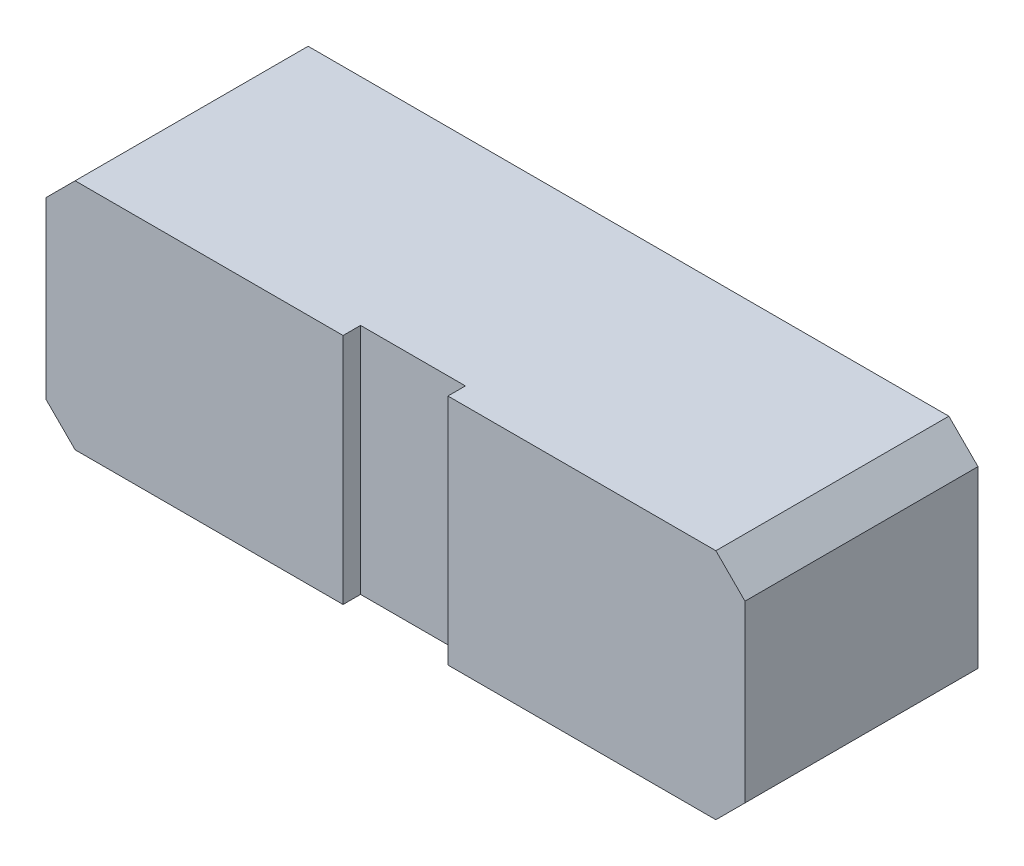
ISO-10303-21;
HEADER;
FILE_DESCRIPTION(('STEP AP214'),'2;1');
FILE_NAME('part.step','',(''),(''),'','','');
FILE_SCHEMA(('AUTOMOTIVE_DESIGN { 1 0 10303 214 1 1 1 1 }'));
ENDSEC;
DATA;
#1=APPLICATION_CONTEXT('core data for automotive mechanical design processes');
#2=APPLICATION_PROTOCOL_DEFINITION('international standard','automotive_design',2000,#1);
#3=PRODUCT_CONTEXT('',#1,'mechanical');
#4=PRODUCT('Part','Part','',(#3));
#5=PRODUCT_RELATED_PRODUCT_CATEGORY('part','',(#4));
#6=PRODUCT_DEFINITION_FORMATION('','',#4);
#7=PRODUCT_DEFINITION_CONTEXT('part definition',#1,'design');
#8=PRODUCT_DEFINITION('design','',#6,#7);
#9=PRODUCT_DEFINITION_SHAPE('','',#8);
#10=(LENGTH_UNIT() NAMED_UNIT(*) SI_UNIT(.MILLI.,.METRE.));
#11=(NAMED_UNIT(*) PLANE_ANGLE_UNIT() SI_UNIT($,.RADIAN.));
#12=(NAMED_UNIT(*) SI_UNIT($,.STERADIAN.) SOLID_ANGLE_UNIT());
#13=UNCERTAINTY_MEASURE_WITH_UNIT(LENGTH_MEASURE(1.E-05),#10,'distance_accuracy_value','');
#14=(GEOMETRIC_REPRESENTATION_CONTEXT(3) GLOBAL_UNCERTAINTY_ASSIGNED_CONTEXT((#13)) GLOBAL_UNIT_ASSIGNED_CONTEXT((#10,
#11,#12)) REPRESENTATION_CONTEXT('',''));
#15=CARTESIAN_POINT('',(0.,0.,0.));
#16=DIRECTION('',(0.,0.,1.));
#17=DIRECTION('',(1.,0.,0.));
#18=AXIS2_PLACEMENT_3D('',#15,#16,#17);
#19=CARTESIAN_POINT('',(0.,0.,20.));
#20=DIRECTION('',(0.,0.,1.));
#21=DIRECTION('',(1.,0.,0.));
#22=AXIS2_PLACEMENT_3D('',#19,#20,#21);
#23=PLANE('',#22);
#24=DIRECTION('',(0.,1.,0.));
#25=VECTOR('',#24,1.);
#26=CARTESIAN_POINT('',(60.,20.,20.));
#27=LINE('',#26,#25);
#28=CARTESIAN_POINT('',(60.,-15.,20.));
#29=VERTEX_POINT('',#28);
#30=CARTESIAN_POINT('',(60.,15.,20.));
#31=VERTEX_POINT('',#30);
#32=EDGE_CURVE('E164',#29,#31,#27,.T.);
#33=ORIENTED_EDGE('',*,*,#32,.T.);
#34=DIRECTION('',(0.707106781186547,-0.707106781186549,0.));
#35=VECTOR('',#34,1.);
#36=CARTESIAN_POINT('',(37.5000000000001,37.5,20.));
#37=LINE('',#36,#35);
#38=CARTESIAN_POINT('',(55.,20.,20.));
#39=VERTEX_POINT('',#38);
#40=EDGE_CURVE('E205',#31,#39,#37,.F.);
#41=ORIENTED_EDGE('',*,*,#40,.T.);
#42=DIRECTION('',(-1.,0.,0.));
#43=VECTOR('',#42,1.);
#44=CARTESIAN_POINT('',(-60.,20.,20.));
#45=LINE('',#44,#43);
#46=CARTESIAN_POINT('',(9.,20.,20.));
#47=VERTEX_POINT('',#46);
#48=EDGE_CURVE('E169',#39,#47,#45,.T.);
#49=ORIENTED_EDGE('',*,*,#48,.T.);
#50=DIRECTION('',(0.,1.,0.));
#51=VECTOR('',#50,1.);
#52=CARTESIAN_POINT('',(9.,20.,20.));
#53=LINE('',#52,#51);
#54=CARTESIAN_POINT('',(9.,-20.,20.));
#55=VERTEX_POINT('',#54);
#56=EDGE_CURVE('E130',#55,#47,#53,.T.);
#57=ORIENTED_EDGE('',*,*,#56,.F.);
#58=DIRECTION('',(1.,0.,0.));
#59=VECTOR('',#58,1.);
#60=CARTESIAN_POINT('',(-60.,-20.,20.));
#61=LINE('',#60,#59);
#62=CARTESIAN_POINT('',(55.,-20.,20.));
#63=VERTEX_POINT('',#62);
#64=EDGE_CURVE('E173',#55,#63,#61,.T.);
#65=ORIENTED_EDGE('',*,*,#64,.T.);
#66=DIRECTION('',(-0.707106781186549,-0.707106781186547,0.));
#67=VECTOR('',#66,1.);
#68=CARTESIAN_POINT('',(37.4999999999999,-37.5,20.));
#69=LINE('',#68,#67);
#70=EDGE_CURVE('E203',#63,#29,#69,.F.);
#71=ORIENTED_EDGE('',*,*,#70,.T.);
#72=EDGE_LOOP('',(#33,#41,#49,#57,#65,#71));
#73=FACE_BOUND('',#72,.T.);
#74=ADVANCED_FACE('F35',(#73),#23,.T.);
#75=CARTESIAN_POINT('',(60.,20.,20.));
#76=DIRECTION('',(-1.,0.,0.));
#77=DIRECTION('',(0.,-1.,0.));
#78=AXIS2_PLACEMENT_3D('',#75,#76,#77);
#79=PLANE('',#78);
#80=DIRECTION('',(0.,1.,0.));
#81=VECTOR('',#80,1.);
#82=CARTESIAN_POINT('',(60.,20.,-20.));
#83=LINE('',#82,#81);
#84=CARTESIAN_POINT('',(60.,-15.,-20.));
#85=VERTEX_POINT('',#84);
#86=CARTESIAN_POINT('',(60.,15.,-20.));
#87=VERTEX_POINT('',#86);
#88=EDGE_CURVE('E159',#85,#87,#83,.T.);
#89=ORIENTED_EDGE('',*,*,#88,.T.);
#90=DIRECTION('',(0.,0.,1.));
#91=VECTOR('',#90,1.);
#92=CARTESIAN_POINT('',(60.,15.,20.));
#93=LINE('',#92,#91);
#94=EDGE_CURVE('E201',#87,#31,#93,.T.);
#95=ORIENTED_EDGE('',*,*,#94,.T.);
#96=ORIENTED_EDGE('',*,*,#32,.F.);
#97=DIRECTION('',(0.,0.,-1.));
#98=VECTOR('',#97,1.);
#99=CARTESIAN_POINT('',(60.,-15.,20.));
#100=LINE('',#99,#98);
#101=EDGE_CURVE('E198',#29,#85,#100,.T.);
#102=ORIENTED_EDGE('',*,*,#101,.T.);
#103=EDGE_LOOP('',(#89,#95,#96,#102));
#104=FACE_BOUND('',#103,.T.);
#105=ADVANCED_FACE('F240',(#104),#79,.F.);
#106=CARTESIAN_POINT('',(-60.,20.,20.));
#107=DIRECTION('',(0.,-1.,0.));
#108=DIRECTION('',(0.,0.,-1.));
#109=AXIS2_PLACEMENT_3D('',#106,#107,#108);
#110=PLANE('',#109);
#111=ORIENTED_EDGE('',*,*,#48,.F.);
#112=DIRECTION('',(0.,0.,-1.));
#113=VECTOR('',#112,1.);
#114=CARTESIAN_POINT('',(55.,20.,20.));
#115=LINE('',#114,#113);
#116=CARTESIAN_POINT('',(55.,20.,-20.));
#117=VERTEX_POINT('',#116);
#118=EDGE_CURVE('E187',#39,#117,#115,.T.);
#119=ORIENTED_EDGE('',*,*,#118,.T.);
#120=DIRECTION('',(-1.,0.,0.));
#121=VECTOR('',#120,1.);
#122=CARTESIAN_POINT('',(-60.,20.,-20.));
#123=LINE('',#122,#121);
#124=CARTESIAN_POINT('',(-55.,20.,-20.));
#125=VERTEX_POINT('',#124);
#126=EDGE_CURVE('E179',#117,#125,#123,.T.);
#127=ORIENTED_EDGE('',*,*,#126,.T.);
#128=DIRECTION('',(0.,0.,1.));
#129=VECTOR('',#128,1.);
#130=CARTESIAN_POINT('',(-55.,20.,20.));
#131=LINE('',#130,#129);
#132=CARTESIAN_POINT('',(-55.,20.,20.));
#133=VERTEX_POINT('',#132);
#134=EDGE_CURVE('E176',#125,#133,#131,.T.);
#135=ORIENTED_EDGE('',*,*,#134,.T.);
#136=CARTESIAN_POINT('',(-9.,20.,20.));
#137=VERTEX_POINT('',#136);
#138=EDGE_CURVE('E167',#137,#133,#45,.T.);
#139=ORIENTED_EDGE('',*,*,#138,.F.);
#140=DIRECTION('',(0.,0.,1.));
#141=VECTOR('',#140,1.);
#142=CARTESIAN_POINT('',(-9.,20.,17.));
#143=LINE('',#142,#141);
#144=CARTESIAN_POINT('',(-9.,20.,17.));
#145=VERTEX_POINT('',#144);
#146=EDGE_CURVE('E134',#145,#137,#143,.T.);
#147=ORIENTED_EDGE('',*,*,#146,.F.);
#148=DIRECTION('',(-1.,0.,0.));
#149=VECTOR('',#148,1.);
#150=CARTESIAN_POINT('',(-9.,20.,17.));
#151=LINE('',#150,#149);
#152=CARTESIAN_POINT('',(9.,20.,17.));
#153=VERTEX_POINT('',#152);
#154=EDGE_CURVE('E141',#153,#145,#151,.T.);
#155=ORIENTED_EDGE('',*,*,#154,.F.);
#156=DIRECTION('',(0.,0.,1.));
#157=VECTOR('',#156,1.);
#158=CARTESIAN_POINT('',(9.,20.,17.));
#159=LINE('',#158,#157);
#160=EDGE_CURVE('E124',#153,#47,#159,.T.);
#161=ORIENTED_EDGE('',*,*,#160,.T.);
#162=EDGE_LOOP('',(#111,#119,#127,#135,#139,#147,#155,#161));
#163=FACE_BOUND('',#162,.T.);
#164=ADVANCED_FACE('F147',(#163),#110,.F.);
#165=CARTESIAN_POINT('',(-60.,20.,20.));
#166=DIRECTION('',(1.,0.,0.));
#167=DIRECTION('',(0.,1.,0.));
#168=AXIS2_PLACEMENT_3D('',#165,#166,#167);
#169=PLANE('',#168);
#170=DIRECTION('',(0.,-1.,0.));
#171=VECTOR('',#170,1.);
#172=CARTESIAN_POINT('',(-60.,20.,20.));
#173=LINE('',#172,#171);
#174=CARTESIAN_POINT('',(-60.,15.,20.));
#175=VERTEX_POINT('',#174);
#176=CARTESIAN_POINT('',(-60.,-15.,20.));
#177=VERTEX_POINT('',#176);
#178=EDGE_CURVE('E171',#175,#177,#173,.T.);
#179=ORIENTED_EDGE('',*,*,#178,.F.);
#180=DIRECTION('',(0.,0.,-1.));
#181=VECTOR('',#180,1.);
#182=CARTESIAN_POINT('',(-60.,15.,20.));
#183=LINE('',#182,#181);
#184=CARTESIAN_POINT('',(-60.,15.,-20.));
#185=VERTEX_POINT('',#184);
#186=EDGE_CURVE('E213',#175,#185,#183,.T.);
#187=ORIENTED_EDGE('',*,*,#186,.T.);
#188=DIRECTION('',(0.,-1.,0.));
#189=VECTOR('',#188,1.);
#190=CARTESIAN_POINT('',(-60.,20.,-20.));
#191=LINE('',#190,#189);
#192=CARTESIAN_POINT('',(-60.,-15.,-20.));
#193=VERTEX_POINT('',#192);
#194=EDGE_CURVE('E182',#185,#193,#191,.T.);
#195=ORIENTED_EDGE('',*,*,#194,.T.);
#196=DIRECTION('',(0.,0.,1.));
#197=VECTOR('',#196,1.);
#198=CARTESIAN_POINT('',(-60.,-15.,20.));
#199=LINE('',#198,#197);
#200=EDGE_CURVE('E50',#193,#177,#199,.T.);
#201=ORIENTED_EDGE('',*,*,#200,.T.);
#202=EDGE_LOOP('',(#179,#187,#195,#201));
#203=FACE_BOUND('',#202,.T.);
#204=ADVANCED_FACE('F228',(#203),#169,.F.);
#205=CARTESIAN_POINT('',(-60.,-20.,20.));
#206=DIRECTION('',(0.,1.,0.));
#207=DIRECTION('',(0.,0.,1.));
#208=AXIS2_PLACEMENT_3D('',#205,#206,#207);
#209=PLANE('',#208);
#210=DIRECTION('',(1.,0.,0.));
#211=VECTOR('',#210,1.);
#212=CARTESIAN_POINT('',(-60.,-20.,-20.));
#213=LINE('',#212,#211);
#214=CARTESIAN_POINT('',(-55.,-20.,-20.));
#215=VERTEX_POINT('',#214);
#216=CARTESIAN_POINT('',(55.,-20.,-20.));
#217=VERTEX_POINT('',#216);
#218=EDGE_CURVE('E168',#215,#217,#213,.T.);
#219=ORIENTED_EDGE('',*,*,#218,.T.);
#220=DIRECTION('',(0.,0.,1.));
#221=VECTOR('',#220,1.);
#222=CARTESIAN_POINT('',(55.,-20.,20.));
#223=LINE('',#222,#221);
#224=EDGE_CURVE('E210',#217,#63,#223,.T.);
#225=ORIENTED_EDGE('',*,*,#224,.T.);
#226=ORIENTED_EDGE('',*,*,#64,.F.);
#227=DIRECTION('',(0.,0.,1.));
#228=VECTOR('',#227,1.);
#229=CARTESIAN_POINT('',(9.,-20.,17.));
#230=LINE('',#229,#228);
#231=CARTESIAN_POINT('',(9.,-20.,17.));
#232=VERTEX_POINT('',#231);
#233=EDGE_CURVE('E157',#232,#55,#230,.T.);
#234=ORIENTED_EDGE('',*,*,#233,.F.);
#235=DIRECTION('',(1.,0.,0.));
#236=VECTOR('',#235,1.);
#237=CARTESIAN_POINT('',(-9.,-20.,17.));
#238=LINE('',#237,#236);
#239=CARTESIAN_POINT('',(-9.,-20.,17.));
#240=VERTEX_POINT('',#239);
#241=EDGE_CURVE('E135',#240,#232,#238,.T.);
#242=ORIENTED_EDGE('',*,*,#241,.F.);
#243=DIRECTION('',(0.,0.,1.));
#244=VECTOR('',#243,1.);
#245=CARTESIAN_POINT('',(-9.,-20.,17.));
#246=LINE('',#245,#244);
#247=CARTESIAN_POINT('',(-9.,-20.,20.));
#248=VERTEX_POINT('',#247);
#249=EDGE_CURVE('E160',#240,#248,#246,.T.);
#250=ORIENTED_EDGE('',*,*,#249,.T.);
#251=CARTESIAN_POINT('',(-55.,-20.,20.));
#252=VERTEX_POINT('',#251);
#253=EDGE_CURVE('E174',#252,#248,#61,.T.);
#254=ORIENTED_EDGE('',*,*,#253,.F.);
#255=DIRECTION('',(0.,0.,-1.));
#256=VECTOR('',#255,1.);
#257=CARTESIAN_POINT('',(-55.,-20.,20.));
#258=LINE('',#257,#256);
#259=EDGE_CURVE('E207',#252,#215,#258,.T.);
#260=ORIENTED_EDGE('',*,*,#259,.T.);
#261=EDGE_LOOP('',(#219,#225,#226,#234,#242,#250,#254,#260));
#262=FACE_BOUND('',#261,.T.);
#263=ADVANCED_FACE('F222',(#262),#209,.F.);
#264=ORIENTED_EDGE('',*,*,#138,.T.);
#265=DIRECTION('',(0.707106781186548,0.707106781186547,0.));
#266=VECTOR('',#265,1.);
#267=CARTESIAN_POINT('',(-37.4999999999999,37.5,20.));
#268=LINE('',#267,#266);
#269=EDGE_CURVE('E11',#133,#175,#268,.F.);
#270=ORIENTED_EDGE('',*,*,#269,.T.);
#271=ORIENTED_EDGE('',*,*,#178,.T.);
#272=DIRECTION('',(-0.707106781186547,0.707106781186549,0.));
#273=VECTOR('',#272,1.);
#274=CARTESIAN_POINT('',(-37.5000000000001,-37.5,20.));
#275=LINE('',#274,#273);
#276=EDGE_CURVE('E43',#177,#252,#275,.F.);
#277=ORIENTED_EDGE('',*,*,#276,.T.);
#278=ORIENTED_EDGE('',*,*,#253,.T.);
#279=DIRECTION('',(0.,-1.,0.));
#280=VECTOR('',#279,1.);
#281=CARTESIAN_POINT('',(-9.,20.,20.));
#282=LINE('',#281,#280);
#283=EDGE_CURVE('E145',#137,#248,#282,.T.);
#284=ORIENTED_EDGE('',*,*,#283,.F.);
#285=EDGE_LOOP('',(#264,#270,#271,#277,#278,#284));
#286=FACE_BOUND('',#285,.T.);
#287=ADVANCED_FACE('F217',(#286),#23,.T.);
#288=CARTESIAN_POINT('',(0.,0.,-20.));
#289=DIRECTION('',(0.,0.,1.));
#290=DIRECTION('',(1.,0.,0.));
#291=AXIS2_PLACEMENT_3D('',#288,#289,#290);
#292=PLANE('',#291);
#293=ORIENTED_EDGE('',*,*,#126,.F.);
#294=DIRECTION('',(-0.707106781186547,0.707106781186549,0.));
#295=VECTOR('',#294,1.);
#296=CARTESIAN_POINT('',(55.,20.,-20.));
#297=LINE('',#296,#295);
#298=EDGE_CURVE('E196',#117,#87,#297,.F.);
#299=ORIENTED_EDGE('',*,*,#298,.T.);
#300=ORIENTED_EDGE('',*,*,#88,.F.);
#301=DIRECTION('',(0.707106781186549,0.707106781186547,0.));
#302=VECTOR('',#301,1.);
#303=CARTESIAN_POINT('',(60.,-15.,-20.));
#304=LINE('',#303,#302);
#305=EDGE_CURVE('E194',#85,#217,#304,.F.);
#306=ORIENTED_EDGE('',*,*,#305,.T.);
#307=ORIENTED_EDGE('',*,*,#218,.F.);
#308=DIRECTION('',(0.707106781186547,-0.707106781186549,0.));
#309=VECTOR('',#308,1.);
#310=CARTESIAN_POINT('',(-55.,-20.,-20.));
#311=LINE('',#310,#309);
#312=EDGE_CURVE('E190',#215,#193,#311,.F.);
#313=ORIENTED_EDGE('',*,*,#312,.T.);
#314=ORIENTED_EDGE('',*,*,#194,.F.);
#315=DIRECTION('',(-0.707106781186548,-0.707106781186547,0.));
#316=VECTOR('',#315,1.);
#317=CARTESIAN_POINT('',(-60.,15.,-20.));
#318=LINE('',#317,#316);
#319=EDGE_CURVE('E192',#185,#125,#318,.F.);
#320=ORIENTED_EDGE('',*,*,#319,.T.);
#321=EDGE_LOOP('',(#293,#299,#300,#306,#307,#313,#314,#320));
#322=FACE_BOUND('',#321,.T.);
#323=ADVANCED_FACE('F227',(#322),#292,.F.);
#324=CARTESIAN_POINT('',(9.,20.,17.));
#325=DIRECTION('',(1.,0.,0.));
#326=DIRECTION('',(0.,0.,-1.));
#327=AXIS2_PLACEMENT_3D('',#324,#325,#326);
#328=PLANE('',#327);
#329=ORIENTED_EDGE('',*,*,#56,.T.);
#330=ORIENTED_EDGE('',*,*,#160,.F.);
#331=DIRECTION('',(0.,1.,0.));
#332=VECTOR('',#331,1.);
#333=CARTESIAN_POINT('',(9.,20.,17.));
#334=LINE('',#333,#332);
#335=EDGE_CURVE('E127',#232,#153,#334,.T.);
#336=ORIENTED_EDGE('',*,*,#335,.F.);
#337=ORIENTED_EDGE('',*,*,#233,.T.);
#338=EDGE_LOOP('',(#329,#330,#336,#337));
#339=FACE_BOUND('',#338,.T.);
#340=ADVANCED_FACE('F126',(#339),#328,.F.);
#341=CARTESIAN_POINT('',(-9.,20.,17.));
#342=DIRECTION('',(-1.,0.,0.));
#343=DIRECTION('',(0.,0.,1.));
#344=AXIS2_PLACEMENT_3D('',#341,#342,#343);
#345=PLANE('',#344);
#346=ORIENTED_EDGE('',*,*,#283,.T.);
#347=ORIENTED_EDGE('',*,*,#249,.F.);
#348=DIRECTION('',(0.,-1.,0.));
#349=VECTOR('',#348,1.);
#350=CARTESIAN_POINT('',(-9.,20.,17.));
#351=LINE('',#350,#349);
#352=EDGE_CURVE('E149',#145,#240,#351,.T.);
#353=ORIENTED_EDGE('',*,*,#352,.F.);
#354=ORIENTED_EDGE('',*,*,#146,.T.);
#355=EDGE_LOOP('',(#346,#347,#353,#354));
#356=FACE_BOUND('',#355,.T.);
#357=ADVANCED_FACE('F343',(#356),#345,.F.);
#358=CARTESIAN_POINT('',(0.,0.,17.));
#359=DIRECTION('',(0.,0.,1.));
#360=DIRECTION('',(1.,0.,0.));
#361=AXIS2_PLACEMENT_3D('',#358,#359,#360);
#362=PLANE('',#361);
#363=ORIENTED_EDGE('',*,*,#335,.T.);
#364=ORIENTED_EDGE('',*,*,#154,.T.);
#365=ORIENTED_EDGE('',*,*,#352,.T.);
#366=ORIENTED_EDGE('',*,*,#241,.T.);
#367=EDGE_LOOP('',(#363,#364,#365,#366));
#368=FACE_BOUND('',#367,.T.);
#369=ADVANCED_FACE('F139',(#368),#362,.T.);
#370=CARTESIAN_POINT('',(55.,20.,20.));
#371=DIRECTION('',(-0.707106781186548,-0.707106781186546,0.));
#372=DIRECTION('',(0.,0.,-1.));
#373=AXIS2_PLACEMENT_3D('',#370,#371,#372);
#374=PLANE('',#373);
#375=ORIENTED_EDGE('',*,*,#40,.F.);
#376=ORIENTED_EDGE('',*,*,#94,.F.);
#377=ORIENTED_EDGE('',*,*,#298,.F.);
#378=ORIENTED_EDGE('',*,*,#118,.F.);
#379=EDGE_LOOP('',(#375,#376,#377,#378));
#380=FACE_BOUND('',#379,.T.);
#381=ADVANCED_FACE('F236',(#380),#374,.F.);
#382=CARTESIAN_POINT('',(60.,-15.,20.));
#383=DIRECTION('',(-0.707106781186546,0.707106781186548,0.));
#384=DIRECTION('',(0.,0.,-1.));
#385=AXIS2_PLACEMENT_3D('',#382,#383,#384);
#386=PLANE('',#385);
#387=ORIENTED_EDGE('',*,*,#70,.F.);
#388=ORIENTED_EDGE('',*,*,#224,.F.);
#389=ORIENTED_EDGE('',*,*,#305,.F.);
#390=ORIENTED_EDGE('',*,*,#101,.F.);
#391=EDGE_LOOP('',(#387,#388,#389,#390));
#392=FACE_BOUND('',#391,.T.);
#393=ADVANCED_FACE('F245',(#392),#386,.F.);
#394=CARTESIAN_POINT('',(-60.,15.,20.));
#395=DIRECTION('',(0.707106781186547,-0.707106781186548,0.));
#396=DIRECTION('',(0.,0.,-1.));
#397=AXIS2_PLACEMENT_3D('',#394,#395,#396);
#398=PLANE('',#397);
#399=ORIENTED_EDGE('',*,*,#269,.F.);
#400=ORIENTED_EDGE('',*,*,#134,.F.);
#401=ORIENTED_EDGE('',*,*,#319,.F.);
#402=ORIENTED_EDGE('',*,*,#186,.F.);
#403=EDGE_LOOP('',(#399,#400,#401,#402));
#404=FACE_BOUND('',#403,.T.);
#405=ADVANCED_FACE('F231',(#404),#398,.F.);
#406=CARTESIAN_POINT('',(-55.,-20.,20.));
#407=DIRECTION('',(0.707106781186548,0.707106781186546,0.));
#408=DIRECTION('',(0.,0.,-1.));
#409=AXIS2_PLACEMENT_3D('',#406,#407,#408);
#410=PLANE('',#409);
#411=ORIENTED_EDGE('',*,*,#276,.F.);
#412=ORIENTED_EDGE('',*,*,#200,.F.);
#413=ORIENTED_EDGE('',*,*,#312,.F.);
#414=ORIENTED_EDGE('',*,*,#259,.F.);
#415=EDGE_LOOP('',(#411,#412,#413,#414));
#416=FACE_BOUND('',#415,.T.);
#417=ADVANCED_FACE('F37',(#416),#410,.F.);
#418=CLOSED_SHELL('',(#74,#105,#164,#204,#263,#287,#323,#340,#357,#369,#381,#393,#405,#417));
#419=MANIFOLD_SOLID_BREP('B2',#418);
#420=ADVANCED_BREP_SHAPE_REPRESENTATION('',(#18,#419),#14);
#421=SHAPE_DEFINITION_REPRESENTATION(#9,#420);
ENDSEC;
END-ISO-10303-21;
